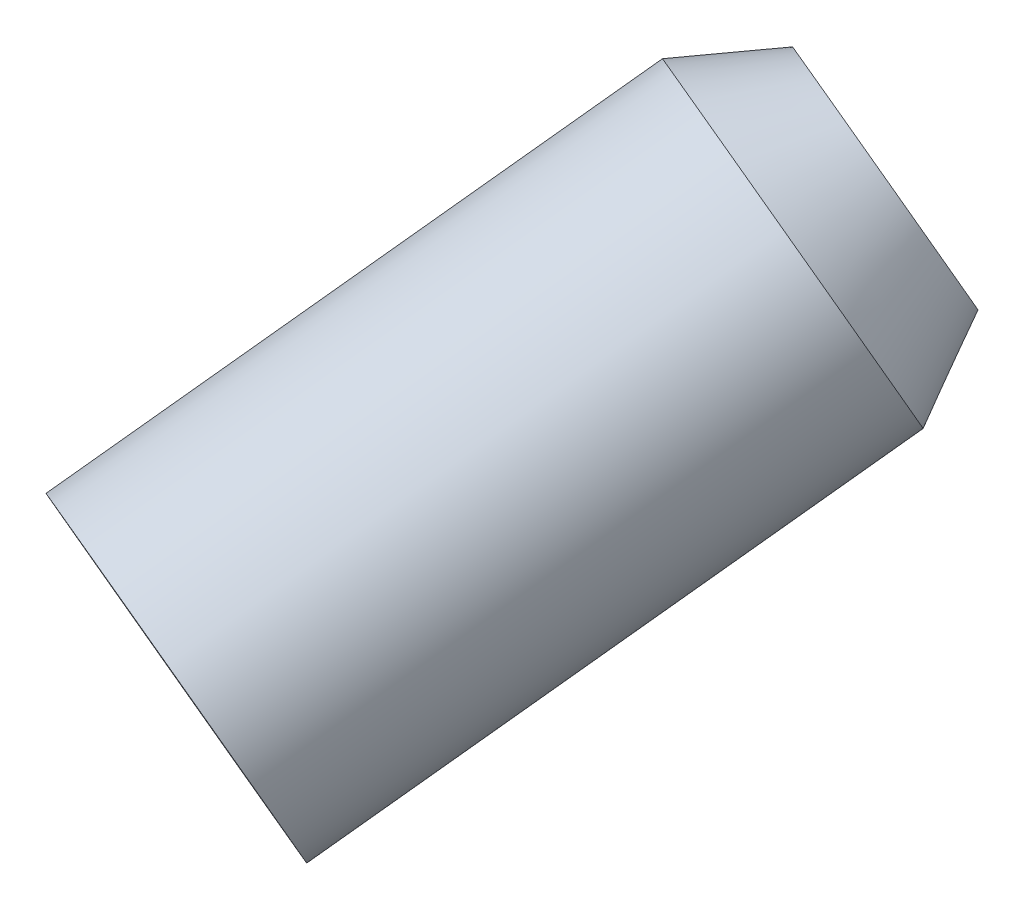
ISO-10303-21;
HEADER;
FILE_DESCRIPTION(('STEP AP214'),'2;1');
FILE_NAME('part.step','',(''),(''),'','','');
FILE_SCHEMA(('AUTOMOTIVE_DESIGN { 1 0 10303 214 1 1 1 1 }'));
ENDSEC;
DATA;
#1=APPLICATION_CONTEXT('core data for automotive mechanical design processes');
#2=APPLICATION_PROTOCOL_DEFINITION('international standard','automotive_design',2000,#1);
#3=PRODUCT_CONTEXT('',#1,'mechanical');
#4=PRODUCT('Part','Part','',(#3));
#5=PRODUCT_RELATED_PRODUCT_CATEGORY('part','',(#4));
#6=PRODUCT_DEFINITION_FORMATION('','',#4);
#7=PRODUCT_DEFINITION_CONTEXT('part definition',#1,'design');
#8=PRODUCT_DEFINITION('design','',#6,#7);
#9=PRODUCT_DEFINITION_SHAPE('','',#8);
#10=(LENGTH_UNIT() NAMED_UNIT(*) SI_UNIT(.MILLI.,.METRE.));
#11=(NAMED_UNIT(*) PLANE_ANGLE_UNIT() SI_UNIT($,.RADIAN.));
#12=(NAMED_UNIT(*) SI_UNIT($,.STERADIAN.) SOLID_ANGLE_UNIT());
#13=UNCERTAINTY_MEASURE_WITH_UNIT(LENGTH_MEASURE(1.E-05),#10,'distance_accuracy_value','');
#14=(GEOMETRIC_REPRESENTATION_CONTEXT(3) GLOBAL_UNCERTAINTY_ASSIGNED_CONTEXT((#13)) GLOBAL_UNIT_ASSIGNED_CONTEXT((#10,
#11,#12)) REPRESENTATION_CONTEXT('',''));
#15=CARTESIAN_POINT('',(0.,0.,0.));
#16=DIRECTION('',(0.,0.,1.));
#17=DIRECTION('',(1.,0.,0.));
#18=AXIS2_PLACEMENT_3D('',#15,#16,#17);
#19=CARTESIAN_POINT('',(94.7036647125522,738.61187319505,-442.307764746316));
#20=DIRECTION('',(0.342020143325553,0.469846310392975,-0.81379768134941));
#21=DIRECTION('',(0.,0.866025403784439,0.5));
#22=AXIS2_PLACEMENT_3D('',#19,#20,#21);
#23=PLANE('',#22);
#24=CARTESIAN_POINT('',(89.8664632968175,735.592522074321,-446.083950617523));
#25=DIRECTION('',(-0.342020143325572,-0.469846310392953,0.813797681349415));
#26=DIRECTION('',(0.,-0.86602540378445,-0.49999999999998));
#27=AXIS2_PLACEMENT_3D('',#24,#25,#26);
#28=CIRCLE('',#27,4.26794919425988);
#29=CARTESIAN_POINT('',(89.8664632968175,731.896369650031,-448.217925214653));
#30=VERTEX_POINT('',#29);
#31=EDGE_CURVE('E18',#30,#30,#28,.T.);
#32=ORIENTED_EDGE('',*,*,#31,.F.);
#33=EDGE_LOOP('',(#32));
#34=FACE_BOUND('',#33,.T.);
#35=ADVANCED_FACE('F15',(#34),#23,.T.);
#36=CARTESIAN_POINT('',(88.8002703846291,718.066274334423,-428.388277549457));
#37=DIRECTION('',(-0.342020143325552,-0.469846310392974,0.813797681349411));
#38=DIRECTION('',(0.,-0.866025403784439,-0.499999999999999));
#39=AXIS2_PLACEMENT_3D('',#36,#37,#38);
#40=PLANE('',#39);
#41=CARTESIAN_POINT('',(81.9999999999966,724.786056934825,-427.366603945694));
#42=DIRECTION('',(0.342020143325542,0.469846310392987,-0.813797681349408));
#43=DIRECTION('',(0.,0.866025403784433,0.50000000000001));
#44=AXIS2_PLACEMENT_3D('',#41,#42,#43);
#45=CIRCLE('',#44,6.0000000000002);
#46=CARTESIAN_POINT('',(81.9999999999966,729.982209357532,-424.366603945694));
#47=VERTEX_POINT('',#46);
#48=EDGE_CURVE('E22',#47,#47,#45,.T.);
#49=ORIENTED_EDGE('',*,*,#48,.F.);
#50=EDGE_LOOP('',(#49));
#51=FACE_BOUND('',#50,.T.);
#52=ADVANCED_FACE('F35',(#51),#40,.T.);
#53=CARTESIAN_POINT('',(88.8404028664934,734.182983142665,-443.642557572648));
#54=DIRECTION('',(-0.342020143325572,-0.469846310392953,0.813797681349415));
#55=DIRECTION('',(0.,-0.86602540378445,-0.49999999999998));
#56=AXIS2_PLACEMENT_3D('',#53,#54,#55);
#57=CONICAL_SURFACE('',#56,6.00000000002561,0.523598775000923);
#58=CARTESIAN_POINT('',(88.8404028665075,734.182983142685,-443.642557572682));
#59=DIRECTION('',(0.342020143325542,0.469846310392987,-0.813797681349408));
#60=DIRECTION('',(0.,0.866025403784433,0.50000000000001));
#61=AXIS2_PLACEMENT_3D('',#58,#59,#60);
#62=CIRCLE('',#61,6.0000000000002);
#63=CARTESIAN_POINT('',(88.8404028665075,739.379135565392,-440.642557572682));
#64=VERTEX_POINT('',#63);
#65=EDGE_CURVE('E10',#64,#64,#62,.F.);
#66=ORIENTED_EDGE('',*,*,#65,.F.);
#67=EDGE_LOOP('',(#66));
#68=FACE_BOUND('',#67,.T.);
#69=ORIENTED_EDGE('',*,*,#31,.T.);
#70=EDGE_LOOP('',(#69));
#71=FACE_BOUND('',#70,.T.);
#72=ADVANCED_FACE('F32',(#68,#71),#57,.T.);
#73=CARTESIAN_POINT('',(79.6704498711397,721.585863746563,-421.823706749588));
#74=DIRECTION('',(0.342020143325542,0.469846310392987,-0.813797681349408));
#75=DIRECTION('',(0.,0.866025403784433,0.50000000000001));
#76=AXIS2_PLACEMENT_3D('',#73,#74,#75);
#77=CYLINDRICAL_SURFACE('',#76,6.0000000000002);
#78=ORIENTED_EDGE('',*,*,#48,.T.);
#79=EDGE_LOOP('',(#78));
#80=FACE_BOUND('',#79,.T.);
#81=ORIENTED_EDGE('',*,*,#65,.T.);
#82=EDGE_LOOP('',(#81));
#83=FACE_BOUND('',#82,.T.);
#84=ADVANCED_FACE('F41',(#80,#83),#77,.T.);
#85=CLOSED_SHELL('',(#35,#52,#72,#84));
#86=MANIFOLD_SOLID_BREP('B1',#85);
#87=ADVANCED_BREP_SHAPE_REPRESENTATION('',(#18,#86),#14);
#88=SHAPE_DEFINITION_REPRESENTATION(#9,#87);
ENDSEC;
END-ISO-10303-21;
